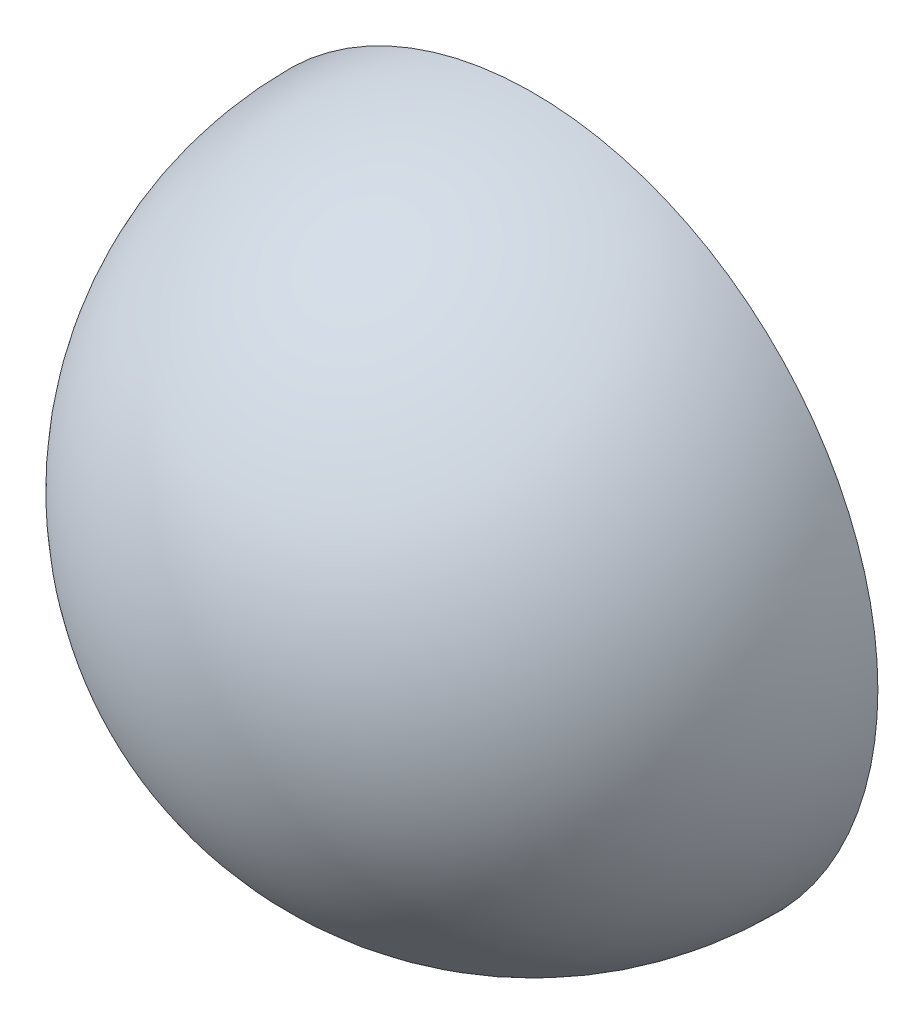
ISO-10303-21;
HEADER;
FILE_DESCRIPTION(('STEP AP214'),'2;1');
FILE_NAME('part.step','',(''),(''),'','','');
FILE_SCHEMA(('AUTOMOTIVE_DESIGN { 1 0 10303 214 1 1 1 1 }'));
ENDSEC;
DATA;
#1=APPLICATION_CONTEXT('core data for automotive mechanical design processes');
#2=APPLICATION_PROTOCOL_DEFINITION('international standard','automotive_design',2000,#1);
#3=PRODUCT_CONTEXT('',#1,'mechanical');
#4=PRODUCT('Part','Part','',(#3));
#5=PRODUCT_RELATED_PRODUCT_CATEGORY('part','',(#4));
#6=PRODUCT_DEFINITION_FORMATION('','',#4);
#7=PRODUCT_DEFINITION_CONTEXT('part definition',#1,'design');
#8=PRODUCT_DEFINITION('design','',#6,#7);
#9=PRODUCT_DEFINITION_SHAPE('','',#8);
#10=(LENGTH_UNIT() NAMED_UNIT(*) SI_UNIT(.MILLI.,.METRE.));
#11=(NAMED_UNIT(*) PLANE_ANGLE_UNIT() SI_UNIT($,.RADIAN.));
#12=(NAMED_UNIT(*) SI_UNIT($,.STERADIAN.) SOLID_ANGLE_UNIT());
#13=UNCERTAINTY_MEASURE_WITH_UNIT(LENGTH_MEASURE(1.E-05),#10,'distance_accuracy_value','');
#14=(GEOMETRIC_REPRESENTATION_CONTEXT(3) GLOBAL_UNCERTAINTY_ASSIGNED_CONTEXT((#13)) GLOBAL_UNIT_ASSIGNED_CONTEXT((#10,
#11,#12)) REPRESENTATION_CONTEXT('',''));
#15=CARTESIAN_POINT('',(0.,0.,0.));
#16=DIRECTION('',(0.,0.,1.));
#17=DIRECTION('',(1.,0.,0.));
#18=AXIS2_PLACEMENT_3D('',#15,#16,#17);
#19=CARTESIAN_POINT('',(0.,0.,0.));
#20=DIRECTION('',(-1.,0.,0.));
#21=DIRECTION('',(0.,-1.,0.));
#22=AXIS2_PLACEMENT_3D('',#19,#20,#21);
#23=SPHERICAL_SURFACE('',#22,9.69722436480724);
#24=CARTESIAN_POINT('',(0.,0.,0.));
#25=DIRECTION('',(0.,0.,-1.));
#26=DIRECTION('',(1.,0.,0.));
#27=AXIS2_PLACEMENT_3D('',#24,#25,#26);
#28=SPHERICAL_SURFACE('',#27,9.69722436480724);
#29=CARTESIAN_POINT('',(0.,0.,0.));
#30=DIRECTION('',(0.,0.,-1.));
#31=DIRECTION('',(1.,0.,0.));
#32=AXIS2_PLACEMENT_3D('',#29,#30,#31);
#33=CIRCLE('',#32,9.69722436480724);
#34=CARTESIAN_POINT('',(9.69722436480724,0.,0.));
#35=VERTEX_POINT('',#34);
#36=EDGE_CURVE('E10',#35,#35,#33,.T.);
#37=ORIENTED_EDGE('',*,*,#36,.F.);
#38=EDGE_LOOP('',(#37));
#39=FACE_BOUND('',#38,.T.);
#40=ADVANCED_FACE('F31',(#39),#28,.T.);
#41=CARTESIAN_POINT('',(0.,0.,0.));
#42=DIRECTION('',(0.,0.,-1.));
#43=DIRECTION('',(1.,0.,0.));
#44=AXIS2_PLACEMENT_3D('',#41,#42,#43);
#45=PLANE('',#44);
#46=ORIENTED_EDGE('',*,*,#36,.T.);
#47=EDGE_LOOP('',(#46));
#48=FACE_BOUND('',#47,.T.);
#49=ADVANCED_FACE('F38',(#48),#45,.T.);
#50=CLOSED_SHELL('',(#40,#49));
#51=MANIFOLD_SOLID_BREP('B2',#50);
#52=ADVANCED_BREP_SHAPE_REPRESENTATION('',(#18,#51),#14);
#53=SHAPE_DEFINITION_REPRESENTATION(#9,#52);
ENDSEC;
END-ISO-10303-21;
